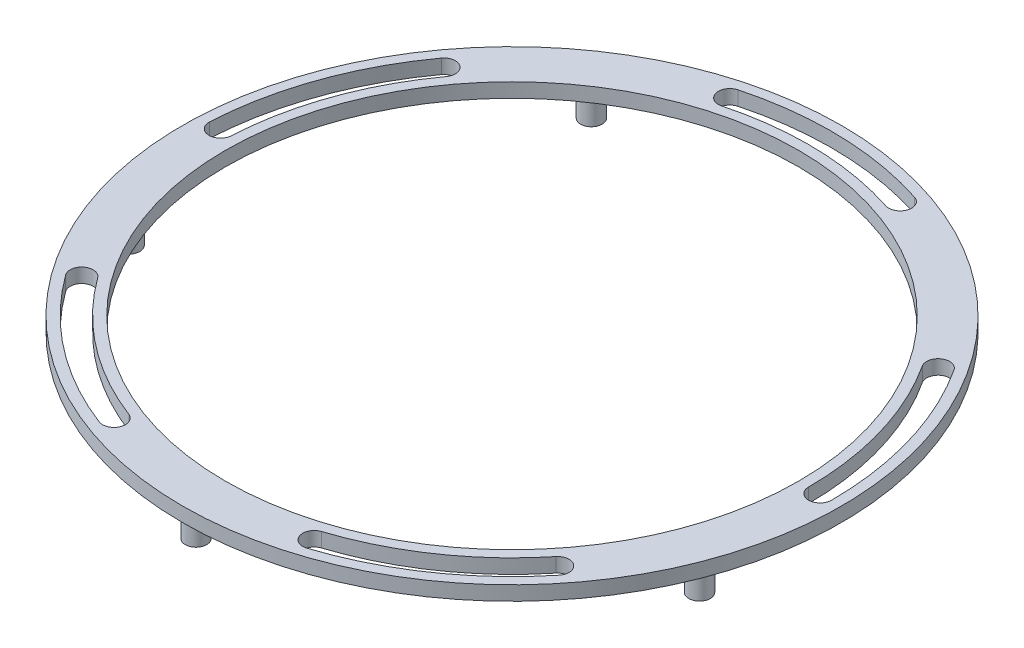
ISO-10303-21;
HEADER;
FILE_DESCRIPTION(('STEP AP214'),'2;1');
FILE_NAME('part.step','',(''),(''),'','','');
FILE_SCHEMA(('AUTOMOTIVE_DESIGN { 1 0 10303 214 1 1 1 1 }'));
ENDSEC;
DATA;
#1=APPLICATION_CONTEXT('core data for automotive mechanical design processes');
#2=APPLICATION_PROTOCOL_DEFINITION('international standard','automotive_design',2000,#1);
#3=PRODUCT_CONTEXT('',#1,'mechanical');
#4=PRODUCT('Part','Part','',(#3));
#5=PRODUCT_RELATED_PRODUCT_CATEGORY('part','',(#4));
#6=PRODUCT_DEFINITION_FORMATION('','',#4);
#7=PRODUCT_DEFINITION_CONTEXT('part definition',#1,'design');
#8=PRODUCT_DEFINITION('design','',#6,#7);
#9=PRODUCT_DEFINITION_SHAPE('','',#8);
#10=(LENGTH_UNIT() NAMED_UNIT(*) SI_UNIT(.MILLI.,.METRE.));
#11=(NAMED_UNIT(*) PLANE_ANGLE_UNIT() SI_UNIT($,.RADIAN.));
#12=(NAMED_UNIT(*) SI_UNIT($,.STERADIAN.) SOLID_ANGLE_UNIT());
#13=UNCERTAINTY_MEASURE_WITH_UNIT(LENGTH_MEASURE(1.E-05),#10,'distance_accuracy_value','');
#14=(GEOMETRIC_REPRESENTATION_CONTEXT(3) GLOBAL_UNCERTAINTY_ASSIGNED_CONTEXT((#13)) GLOBAL_UNIT_ASSIGNED_CONTEXT((#10,
#11,#12)) REPRESENTATION_CONTEXT('',''));
#15=CARTESIAN_POINT('',(0.,0.,0.));
#16=DIRECTION('',(0.,0.,1.));
#17=DIRECTION('',(1.,0.,0.));
#18=AXIS2_PLACEMENT_3D('',#15,#16,#17);
#19=CARTESIAN_POINT('',(0.,2.,0.));
#20=DIRECTION('',(0.,1.,0.));
#21=DIRECTION('',(0.,0.,1.));
#22=AXIS2_PLACEMENT_3D('',#19,#20,#21);
#23=PLANE('',#22);
#24=CARTESIAN_POINT('',(13.2877307581226,2.,-40.8954302006916));
#25=DIRECTION('',(0.,1.,0.));
#26=DIRECTION('',(0.951056516295155,0.,0.309016994374945));
#27=AXIS2_PLACEMENT_3D('',#24,#25,#26);
#28=CIRCLE('',#27,1.6);
#29=CARTESIAN_POINT('',(12.7933035671227,2.,-39.3737397746194));
#30=VERTEX_POINT('',#29);
#31=CARTESIAN_POINT('',(13.7821579491225,2.,-42.4171206267639));
#32=VERTEX_POINT('',#31);
#33=EDGE_CURVE('E50',#30,#32,#28,.T.);
#34=ORIENTED_EDGE('',*,*,#33,.F.);
#35=CARTESIAN_POINT('',(0.,2.,0.));
#36=DIRECTION('',(0.,-1.,0.));
#37=DIRECTION('',(0.951056516295155,0.,0.309016994374945));
#38=AXIS2_PLACEMENT_3D('',#35,#36,#37);
#39=CIRCLE('',#38,41.4);
#40=CARTESIAN_POINT('',(-10.7151084672446,2.,-39.9893292083674));
#41=VERTEX_POINT('',#40);
#42=EDGE_CURVE('E180',#41,#30,#39,.T.);
#43=ORIENTED_EDGE('',*,*,#42,.F.);
#44=CARTESIAN_POINT('',(-11.1292189394086,2.,-41.5348105304299));
#45=DIRECTION('',(0.,1.,0.));
#46=DIRECTION('',(0.951056516295155,0.,0.309016994374945));
#47=AXIS2_PLACEMENT_3D('',#44,#45,#46);
#48=CIRCLE('',#47,1.59999999999999);
#49=CARTESIAN_POINT('',(-11.5433294115726,2.,-43.0802918524924));
#50=VERTEX_POINT('',#49);
#51=EDGE_CURVE('E203',#50,#41,#48,.T.);
#52=ORIENTED_EDGE('',*,*,#51,.F.);
#53=CARTESIAN_POINT('',(0.,2.,0.));
#54=DIRECTION('',(0.,1.,0.));
#55=DIRECTION('',(0.951056516295155,0.,0.309016994374945));
#56=AXIS2_PLACEMENT_3D('',#53,#54,#55);
#57=CIRCLE('',#56,44.6);
#58=EDGE_CURVE('E196',#32,#50,#57,.T.);
#59=ORIENTED_EDGE('',*,*,#58,.F.);
#60=EDGE_LOOP('',(#34,#43,#52,#59));
#61=FACE_BOUND('',#60,.T.);
#62=CARTESIAN_POINT('',(-34.7877307581229,2.,-25.2747658485761));
#63=DIRECTION('',(0.,1.,0.));
#64=DIRECTION('',(0.587785252292469,0.,-0.809016994374951));
#65=AXIS2_PLACEMENT_3D('',#62,#63,#64);
#66=CIRCLE('',#65,1.6);
#67=CARTESIAN_POINT('',(-33.493303567123,2.,-24.3343094449082));
#68=VERTEX_POINT('',#67);
#69=CARTESIAN_POINT('',(-36.0821579491228,2.,-26.2152222522441));
#70=VERTEX_POINT('',#69);
#71=EDGE_CURVE('E58',#68,#70,#66,.T.);
#72=ORIENTED_EDGE('',*,*,#71,.F.);
#73=CARTESIAN_POINT('',(0.,2.,0.));
#74=DIRECTION('',(0.,-1.,0.));
#75=DIRECTION('',(0.587785252292469,0.,-0.809016994374951));
#76=AXIS2_PLACEMENT_3D('',#73,#74,#75);
#77=CIRCLE('',#76,41.4);
#78=CARTESIAN_POINT('',(-41.3432627388394,2.,-2.16670858845756));
#79=VERTEX_POINT('',#78);
#80=EDGE_CURVE('E232',#79,#68,#77,.T.);
#81=ORIENTED_EDGE('',*,*,#80,.F.);
#82=CARTESIAN_POINT('',(-42.9410699944467,2.,-2.25044611844627));
#83=DIRECTION('',(0.,1.,0.));
#84=DIRECTION('',(0.587785252292469,0.,-0.809016994374951));
#85=AXIS2_PLACEMENT_3D('',#82,#83,#84);
#86=CIRCLE('',#85,1.59999999999999);
#87=CARTESIAN_POINT('',(-44.538877250054,2.,-2.33418364843496));
#88=VERTEX_POINT('',#87);
#89=EDGE_CURVE('E229',#88,#79,#86,.T.);
#90=ORIENTED_EDGE('',*,*,#89,.F.);
#91=CARTESIAN_POINT('',(0.,2.,0.));
#92=DIRECTION('',(0.,1.,0.));
#93=DIRECTION('',(0.587785252292469,0.,-0.809016994374951));
#94=AXIS2_PLACEMENT_3D('',#91,#92,#93);
#95=CIRCLE('',#94,44.6);
#96=EDGE_CURVE('E226',#70,#88,#95,.T.);
#97=ORIENTED_EDGE('',*,*,#96,.F.);
#98=EDGE_LOOP('',(#72,#81,#90,#97));
#99=FACE_BOUND('',#98,.T.);
#100=CARTESIAN_POINT('',(-34.7877307581225,2.,25.2747658485766));
#101=DIRECTION('',(0.,1.,0.));
#102=DIRECTION('',(-0.58778525229248,0.,-0.809016994374942));
#103=AXIS2_PLACEMENT_3D('',#100,#101,#102);
#104=CIRCLE('',#103,1.6);
#105=CARTESIAN_POINT('',(-33.4933035671226,2.,24.3343094449087));
#106=VERTEX_POINT('',#105);
#107=CARTESIAN_POINT('',(-36.0821579491224,2.,26.2152222522446));
#108=VERTEX_POINT('',#107);
#109=EDGE_CURVE('E257',#106,#108,#104,.T.);
#110=ORIENTED_EDGE('',*,*,#109,.F.);
#111=CARTESIAN_POINT('',(0.,2.,0.));
#112=DIRECTION('',(0.,-1.,0.));
#113=DIRECTION('',(-0.58778525229248,0.,-0.809016994374942));
#114=AXIS2_PLACEMENT_3D('',#111,#112,#113);
#115=CIRCLE('',#114,41.4);
#116=CARTESIAN_POINT('',(-14.836433111175,2.,38.6502296569843));
#117=VERTEX_POINT('',#116);
#118=EDGE_CURVE('E265',#117,#106,#115,.T.);
#119=ORIENTED_EDGE('',*,*,#118,.F.);
#120=CARTESIAN_POINT('',(-15.4098218304475,2.,40.1439583393798));
#121=DIRECTION('',(0.,1.,0.));
#122=DIRECTION('',(-0.58778525229248,0.,-0.809016994374942));
#123=AXIS2_PLACEMENT_3D('',#120,#121,#122);
#124=CIRCLE('',#123,1.59999999999999);
#125=CARTESIAN_POINT('',(-15.9832105497199,2.,41.6376870217753));
#126=VERTEX_POINT('',#125);
#127=EDGE_CURVE('E262',#126,#117,#124,.T.);
#128=ORIENTED_EDGE('',*,*,#127,.F.);
#129=CARTESIAN_POINT('',(0.,2.,0.));
#130=DIRECTION('',(0.,1.,0.));
#131=DIRECTION('',(-0.58778525229248,0.,-0.809016994374942));
#132=AXIS2_PLACEMENT_3D('',#129,#130,#131);
#133=CIRCLE('',#132,44.6);
#134=EDGE_CURVE('E259',#108,#126,#133,.T.);
#135=ORIENTED_EDGE('',*,*,#134,.F.);
#136=EDGE_LOOP('',(#110,#119,#128,#135));
#137=FACE_BOUND('',#136,.T.);
#138=CARTESIAN_POINT('',(13.2877307581232,2.,40.8954302006915));
#139=DIRECTION('',(0.,1.,0.));
#140=DIRECTION('',(-0.95105651629515,0.,0.309016994374958));
#141=AXIS2_PLACEMENT_3D('',#138,#139,#140);
#142=CIRCLE('',#141,1.6);
#143=CARTESIAN_POINT('',(12.7933035671233,2.,39.3737397746192));
#144=VERTEX_POINT('',#143);
#145=CARTESIAN_POINT('',(13.7821579491231,2.,42.4171206267637));
#146=VERTEX_POINT('',#145);
#147=EDGE_CURVE('E291',#144,#146,#142,.T.);
#148=ORIENTED_EDGE('',*,*,#147,.F.);
#149=CARTESIAN_POINT('',(0.,2.,0.));
#150=DIRECTION('',(0.,-1.,0.));
#151=DIRECTION('',(-0.95105651629515,0.,0.309016994374958));
#152=AXIS2_PLACEMENT_3D('',#149,#150,#151);
#153=CIRCLE('',#152,41.4);
#154=CARTESIAN_POINT('',(32.1738428043189,2.,26.0538641894628));
#155=VERTEX_POINT('',#154);
#156=EDGE_CURVE('E299',#155,#144,#153,.T.);
#157=ORIENTED_EDGE('',*,*,#156,.F.);
#158=CARTESIAN_POINT('',(33.4172763426501,2.,27.0607768151426));
#159=DIRECTION('',(0.,1.,0.));
#160=DIRECTION('',(-0.95105651629515,0.,0.309016994374958));
#161=AXIS2_PLACEMENT_3D('',#158,#159,#160);
#162=CIRCLE('',#161,1.59999999999999);
#163=CARTESIAN_POINT('',(34.6607098809813,2.,28.0676894408223));
#164=VERTEX_POINT('',#163);
#165=EDGE_CURVE('E296',#164,#155,#162,.T.);
#166=ORIENTED_EDGE('',*,*,#165,.F.);
#167=CARTESIAN_POINT('',(0.,2.,0.));
#168=DIRECTION('',(0.,1.,0.));
#169=DIRECTION('',(-0.95105651629515,0.,0.309016994374958));
#170=AXIS2_PLACEMENT_3D('',#167,#168,#169);
#171=CIRCLE('',#170,44.6);
#172=EDGE_CURVE('E293',#146,#164,#171,.T.);
#173=ORIENTED_EDGE('',*,*,#172,.F.);
#174=EDGE_LOOP('',(#148,#157,#166,#173));
#175=FACE_BOUND('',#174,.T.);
#176=CARTESIAN_POINT('',(43.,2.,0.));
#177=DIRECTION('',(0.,1.,0.));
#178=DIRECTION('',(0.,0.,1.));
#179=AXIS2_PLACEMENT_3D('',#176,#177,#178);
#180=CIRCLE('',#179,1.6);
#181=CARTESIAN_POINT('',(41.4,2.,0.));
#182=VERTEX_POINT('',#181);
#183=CARTESIAN_POINT('',(44.6,2.,0.));
#184=VERTEX_POINT('',#183);
#185=EDGE_CURVE('E327',#182,#184,#180,.T.);
#186=ORIENTED_EDGE('',*,*,#185,.F.);
#187=CARTESIAN_POINT('',(0.,2.,0.));
#188=DIRECTION('',(0.,-1.,0.));
#189=DIRECTION('',(0.,0.,1.));
#190=AXIS2_PLACEMENT_3D('',#187,#188,#189);
#191=CIRCLE('',#190,41.4);
#192=CARTESIAN_POINT('',(34.7209615129405,2.,-22.5480560496222));
#193=VERTEX_POINT('',#192);
#194=EDGE_CURVE('E335',#193,#182,#191,.T.);
#195=ORIENTED_EDGE('',*,*,#194,.F.);
#196=CARTESIAN_POINT('',(36.0628344216532,2.,-23.4194785056462));
#197=DIRECTION('',(0.,1.,0.));
#198=DIRECTION('',(0.,0.,1.));
#199=AXIS2_PLACEMENT_3D('',#196,#197,#198);
#200=CIRCLE('',#199,1.59999999999999);
#201=CARTESIAN_POINT('',(37.4047073303659,2.,-24.2909009616703));
#202=VERTEX_POINT('',#201);
#203=EDGE_CURVE('E332',#202,#193,#200,.T.);
#204=ORIENTED_EDGE('',*,*,#203,.F.);
#205=CARTESIAN_POINT('',(0.,2.,0.));
#206=DIRECTION('',(0.,1.,0.));
#207=DIRECTION('',(0.,0.,1.));
#208=AXIS2_PLACEMENT_3D('',#205,#206,#207);
#209=CIRCLE('',#208,44.6);
#210=EDGE_CURVE('E329',#184,#202,#209,.T.);
#211=ORIENTED_EDGE('',*,*,#210,.F.);
#212=EDGE_LOOP('',(#186,#195,#204,#211));
#213=FACE_BOUND('',#212,.T.);
#214=CARTESIAN_POINT('',(0.,2.,0.));
#215=DIRECTION('',(0.,1.,0.));
#216=DIRECTION('',(0.,0.,1.));
#217=AXIS2_PLACEMENT_3D('',#214,#215,#216);
#218=CIRCLE('',#217,46.);
#219=CARTESIAN_POINT('',(0.,2.,46.));
#220=VERTEX_POINT('',#219);
#221=EDGE_CURVE('E11',#220,#220,#218,.T.);
#222=ORIENTED_EDGE('',*,*,#221,.T.);
#223=EDGE_LOOP('',(#222));
#224=FACE_BOUND('',#223,.T.);
#225=CARTESIAN_POINT('',(0.,2.,0.));
#226=DIRECTION('',(0.,1.,0.));
#227=DIRECTION('',(0.,0.,1.));
#228=AXIS2_PLACEMENT_3D('',#225,#226,#227);
#229=CIRCLE('',#228,40.);
#230=CARTESIAN_POINT('',(0.,2.,40.));
#231=VERTEX_POINT('',#230);
#232=EDGE_CURVE('E353',#231,#231,#229,.T.);
#233=ORIENTED_EDGE('',*,*,#232,.F.);
#234=EDGE_LOOP('',(#233));
#235=FACE_BOUND('',#234,.T.);
#236=ADVANCED_FACE('F35',(#61,#99,#137,#175,#213,#224,#235),#23,.T.);
#237=CARTESIAN_POINT('',(0.,0.,0.));
#238=DIRECTION('',(0.,1.,0.));
#239=DIRECTION('',(0.,0.,1.));
#240=AXIS2_PLACEMENT_3D('',#237,#238,#239);
#241=PLANE('',#240);
#242=CARTESIAN_POINT('',(0.,0.,0.));
#243=DIRECTION('',(0.,1.,0.));
#244=DIRECTION('',(0.,0.,1.));
#245=AXIS2_PLACEMENT_3D('',#242,#243,#244);
#246=CIRCLE('',#245,41.4);
#247=CARTESIAN_POINT('',(12.7933035671227,0.,-39.3737397746194));
#248=VERTEX_POINT('',#247);
#249=CARTESIAN_POINT('',(-10.7151084672446,0.,-39.9893292083674));
#250=VERTEX_POINT('',#249);
#251=EDGE_CURVE('E194',#248,#250,#246,.T.);
#252=ORIENTED_EDGE('',*,*,#251,.F.);
#253=CARTESIAN_POINT('',(13.2877307581226,0.,-40.8954302006916));
#254=DIRECTION('',(0.,1.,0.));
#255=DIRECTION('',(0.,0.,1.));
#256=AXIS2_PLACEMENT_3D('',#253,#254,#255);
#257=CIRCLE('',#256,1.6);
#258=CARTESIAN_POINT('',(13.7821579491225,0.,-42.4171206267639));
#259=VERTEX_POINT('',#258);
#260=EDGE_CURVE('E174',#259,#248,#257,.F.);
#261=ORIENTED_EDGE('',*,*,#260,.F.);
#262=CARTESIAN_POINT('',(0.,0.,0.));
#263=DIRECTION('',(0.,1.,0.));
#264=DIRECTION('',(0.,0.,1.));
#265=AXIS2_PLACEMENT_3D('',#262,#263,#264);
#266=CIRCLE('',#265,44.6);
#267=CARTESIAN_POINT('',(-11.5433294115726,0.,-43.0802918524924));
#268=VERTEX_POINT('',#267);
#269=EDGE_CURVE('E184',#268,#259,#266,.F.);
#270=ORIENTED_EDGE('',*,*,#269,.F.);
#271=CARTESIAN_POINT('',(-11.1292189394086,0.,-41.5348105304299));
#272=DIRECTION('',(0.,1.,0.));
#273=DIRECTION('',(0.,0.,1.));
#274=AXIS2_PLACEMENT_3D('',#271,#272,#273);
#275=CIRCLE('',#274,1.59999999999999);
#276=EDGE_CURVE('E198',#250,#268,#275,.F.);
#277=ORIENTED_EDGE('',*,*,#276,.F.);
#278=EDGE_LOOP('',(#252,#261,#270,#277));
#279=FACE_BOUND('',#278,.T.);
#280=CARTESIAN_POINT('',(-24.355468187768,0.,-35.4374261107465));
#281=DIRECTION('',(0.,1.,0.));
#282=DIRECTION('',(0.,0.,1.));
#283=AXIS2_PLACEMENT_3D('',#280,#281,#282);
#284=CIRCLE('',#283,1.5);
#285=CARTESIAN_POINT('',(-24.355468187768,0.,-33.9374261107465));
#286=VERTEX_POINT('',#285);
#287=EDGE_CURVE('E212',#286,#286,#284,.F.);
#288=ORIENTED_EDGE('',*,*,#287,.F.);
#289=EDGE_LOOP('',(#288));
#290=FACE_BOUND('',#289,.T.);
#291=CARTESIAN_POINT('',(0.,0.,0.));
#292=DIRECTION('',(0.,1.,0.));
#293=DIRECTION('',(0.,0.,1.));
#294=AXIS2_PLACEMENT_3D('',#291,#292,#293);
#295=CIRCLE('',#294,41.4);
#296=CARTESIAN_POINT('',(-33.493303567123,0.,-24.3343094449082));
#297=VERTEX_POINT('',#296);
#298=CARTESIAN_POINT('',(-41.3432627388394,0.,-2.16670858845756));
#299=VERTEX_POINT('',#298);
#300=EDGE_CURVE('E218',#297,#299,#295,.T.);
#301=ORIENTED_EDGE('',*,*,#300,.F.);
#302=CARTESIAN_POINT('',(-34.7877307581229,0.,-25.2747658485761));
#303=DIRECTION('',(0.,1.,0.));
#304=DIRECTION('',(0.,0.,1.));
#305=AXIS2_PLACEMENT_3D('',#302,#303,#304);
#306=CIRCLE('',#305,1.6);
#307=CARTESIAN_POINT('',(-36.0821579491228,0.,-26.2152222522441));
#308=VERTEX_POINT('',#307);
#309=EDGE_CURVE('E222',#308,#297,#306,.F.);
#310=ORIENTED_EDGE('',*,*,#309,.F.);
#311=CARTESIAN_POINT('',(0.,0.,0.));
#312=DIRECTION('',(0.,1.,0.));
#313=DIRECTION('',(0.,0.,1.));
#314=AXIS2_PLACEMENT_3D('',#311,#312,#313);
#315=CIRCLE('',#314,44.6);
#316=CARTESIAN_POINT('',(-44.538877250054,0.,-2.33418364843496));
#317=VERTEX_POINT('',#316);
#318=EDGE_CURVE('E215',#317,#308,#315,.F.);
#319=ORIENTED_EDGE('',*,*,#318,.F.);
#320=CARTESIAN_POINT('',(-42.9410699944467,0.,-2.25044611844627));
#321=DIRECTION('',(0.,1.,0.));
#322=DIRECTION('',(0.,0.,1.));
#323=AXIS2_PLACEMENT_3D('',#320,#321,#322);
#324=CIRCLE('',#323,1.59999999999999);
#325=EDGE_CURVE('E216',#299,#317,#324,.F.);
#326=ORIENTED_EDGE('',*,*,#325,.F.);
#327=EDGE_LOOP('',(#301,#310,#319,#326));
#328=FACE_BOUND('',#327,.T.);
#329=CARTESIAN_POINT('',(-41.2292485993322,0.,12.212659822269));
#330=DIRECTION('',(0.,1.,0.));
#331=DIRECTION('',(0.,0.,1.));
#332=AXIS2_PLACEMENT_3D('',#329,#330,#331);
#333=CIRCLE('',#332,1.5);
#334=CARTESIAN_POINT('',(-41.2292485993322,0.,13.712659822269));
#335=VERTEX_POINT('',#334);
#336=EDGE_CURVE('E219',#335,#335,#333,.F.);
#337=ORIENTED_EDGE('',*,*,#336,.F.);
#338=EDGE_LOOP('',(#337));
#339=FACE_BOUND('',#338,.T.);
#340=CARTESIAN_POINT('',(0.,0.,0.));
#341=DIRECTION('',(0.,1.,0.));
#342=DIRECTION('',(0.,0.,1.));
#343=AXIS2_PLACEMENT_3D('',#340,#341,#342);
#344=CIRCLE('',#343,41.4);
#345=CARTESIAN_POINT('',(-33.4933035671226,0.,24.3343094449087));
#346=VERTEX_POINT('',#345);
#347=CARTESIAN_POINT('',(-14.836433111175,0.,38.6502296569843));
#348=VERTEX_POINT('',#347);
#349=EDGE_CURVE('E250',#346,#348,#344,.T.);
#350=ORIENTED_EDGE('',*,*,#349,.F.);
#351=CARTESIAN_POINT('',(-34.7877307581225,0.,25.2747658485766));
#352=DIRECTION('',(0.,1.,0.));
#353=DIRECTION('',(0.,0.,1.));
#354=AXIS2_PLACEMENT_3D('',#351,#352,#353);
#355=CIRCLE('',#354,1.6);
#356=CARTESIAN_POINT('',(-36.0821579491224,0.,26.2152222522446));
#357=VERTEX_POINT('',#356);
#358=EDGE_CURVE('E254',#357,#346,#355,.F.);
#359=ORIENTED_EDGE('',*,*,#358,.F.);
#360=CARTESIAN_POINT('',(0.,0.,0.));
#361=DIRECTION('',(0.,1.,0.));
#362=DIRECTION('',(0.,0.,1.));
#363=AXIS2_PLACEMENT_3D('',#360,#361,#362);
#364=CIRCLE('',#363,44.6);
#365=CARTESIAN_POINT('',(-15.9832105497199,0.,41.6376870217753));
#366=VERTEX_POINT('',#365);
#367=EDGE_CURVE('E247',#366,#357,#364,.F.);
#368=ORIENTED_EDGE('',*,*,#367,.F.);
#369=CARTESIAN_POINT('',(-15.4098218304475,0.,40.1439583393798));
#370=DIRECTION('',(0.,1.,0.));
#371=DIRECTION('',(0.,0.,1.));
#372=AXIS2_PLACEMENT_3D('',#369,#370,#371);
#373=CIRCLE('',#372,1.59999999999999);
#374=EDGE_CURVE('E248',#348,#366,#373,.F.);
#375=ORIENTED_EDGE('',*,*,#374,.F.);
#376=EDGE_LOOP('',(#350,#359,#368,#375));
#377=FACE_BOUND('',#376,.T.);
#378=CARTESIAN_POINT('',(-1.12560877723803,0.,42.985264973949));
#379=DIRECTION('',(0.,1.,0.));
#380=DIRECTION('',(0.,0.,1.));
#381=AXIS2_PLACEMENT_3D('',#378,#379,#380);
#382=CIRCLE('',#381,1.5);
#383=CARTESIAN_POINT('',(-1.12560877723803,0.,44.485264973949));
#384=VERTEX_POINT('',#383);
#385=EDGE_CURVE('E251',#384,#384,#382,.F.);
#386=ORIENTED_EDGE('',*,*,#385,.F.);
#387=EDGE_LOOP('',(#386));
#388=FACE_BOUND('',#387,.T.);
#389=CARTESIAN_POINT('',(0.,0.,0.));
#390=DIRECTION('',(0.,1.,0.));
#391=DIRECTION('',(0.,0.,1.));
#392=AXIS2_PLACEMENT_3D('',#389,#390,#391);
#393=CIRCLE('',#392,41.4);
#394=CARTESIAN_POINT('',(12.7933035671233,0.,39.3737397746192));
#395=VERTEX_POINT('',#394);
#396=CARTESIAN_POINT('',(32.1738428043189,0.,26.0538641894628));
#397=VERTEX_POINT('',#396);
#398=EDGE_CURVE('E284',#395,#397,#393,.T.);
#399=ORIENTED_EDGE('',*,*,#398,.F.);
#400=CARTESIAN_POINT('',(13.2877307581232,0.,40.8954302006915));
#401=DIRECTION('',(0.,1.,0.));
#402=DIRECTION('',(0.,0.,1.));
#403=AXIS2_PLACEMENT_3D('',#400,#401,#402);
#404=CIRCLE('',#403,1.6);
#405=CARTESIAN_POINT('',(13.7821579491231,0.,42.4171206267637));
#406=VERTEX_POINT('',#405);
#407=EDGE_CURVE('E288',#406,#395,#404,.F.);
#408=ORIENTED_EDGE('',*,*,#407,.F.);
#409=CARTESIAN_POINT('',(0.,0.,0.));
#410=DIRECTION('',(0.,1.,0.));
#411=DIRECTION('',(0.,0.,1.));
#412=AXIS2_PLACEMENT_3D('',#409,#410,#411);
#413=CIRCLE('',#412,44.6);
#414=CARTESIAN_POINT('',(34.6607098809813,0.,28.0676894408223));
#415=VERTEX_POINT('',#414);
#416=EDGE_CURVE('E281',#415,#406,#413,.F.);
#417=ORIENTED_EDGE('',*,*,#416,.F.);
#418=CARTESIAN_POINT('',(33.4172763426501,0.,27.0607768151426));
#419=DIRECTION('',(0.,1.,0.));
#420=DIRECTION('',(0.,0.,1.));
#421=AXIS2_PLACEMENT_3D('',#418,#419,#420);
#422=CIRCLE('',#421,1.59999999999999);
#423=EDGE_CURVE('E282',#397,#415,#422,.F.);
#424=ORIENTED_EDGE('',*,*,#423,.F.);
#425=EDGE_LOOP('',(#399,#408,#417,#424));
#426=FACE_BOUND('',#425,.T.);
#427=CARTESIAN_POINT('',(40.5335841169639,0.,14.3536949470516));
#428=DIRECTION('',(0.,1.,0.));
#429=DIRECTION('',(0.,0.,1.));
#430=AXIS2_PLACEMENT_3D('',#427,#428,#429);
#431=CIRCLE('',#430,1.5);
#432=CARTESIAN_POINT('',(40.5335841169639,0.,15.8536949470516));
#433=VERTEX_POINT('',#432);
#434=EDGE_CURVE('E285',#433,#433,#431,.F.);
#435=ORIENTED_EDGE('',*,*,#434,.F.);
#436=EDGE_LOOP('',(#435));
#437=FACE_BOUND('',#436,.T.);
#438=CARTESIAN_POINT('',(0.,0.,0.));
#439=DIRECTION('',(0.,1.,0.));
#440=DIRECTION('',(0.,0.,1.));
#441=AXIS2_PLACEMENT_3D('',#438,#439,#440);
#442=CIRCLE('',#441,41.4);
#443=CARTESIAN_POINT('',(41.4,0.,0.));
#444=VERTEX_POINT('',#443);
#445=CARTESIAN_POINT('',(34.7209615129405,0.,-22.5480560496222));
#446=VERTEX_POINT('',#445);
#447=EDGE_CURVE('E321',#444,#446,#442,.T.);
#448=ORIENTED_EDGE('',*,*,#447,.F.);
#449=CARTESIAN_POINT('',(43.,0.,0.));
#450=DIRECTION('',(0.,1.,0.));
#451=DIRECTION('',(0.,0.,1.));
#452=AXIS2_PLACEMENT_3D('',#449,#450,#451);
#453=CIRCLE('',#452,1.6);
#454=CARTESIAN_POINT('',(44.6,0.,0.));
#455=VERTEX_POINT('',#454);
#456=EDGE_CURVE('E324',#455,#444,#453,.F.);
#457=ORIENTED_EDGE('',*,*,#456,.F.);
#458=CARTESIAN_POINT('',(0.,0.,0.));
#459=DIRECTION('',(0.,1.,0.));
#460=DIRECTION('',(0.,0.,1.));
#461=AXIS2_PLACEMENT_3D('',#458,#459,#460);
#462=CIRCLE('',#461,44.6);
#463=CARTESIAN_POINT('',(37.4047073303659,0.,-24.2909009616703));
#464=VERTEX_POINT('',#463);
#465=EDGE_CURVE('E341',#464,#455,#462,.F.);
#466=ORIENTED_EDGE('',*,*,#465,.F.);
#467=CARTESIAN_POINT('',(36.0628344216532,0.,-23.4194785056462));
#468=DIRECTION('',(0.,1.,0.));
#469=DIRECTION('',(0.,0.,1.));
#470=AXIS2_PLACEMENT_3D('',#467,#468,#469);
#471=CIRCLE('',#470,1.59999999999999);
#472=EDGE_CURVE('E319',#446,#464,#471,.F.);
#473=ORIENTED_EDGE('',*,*,#472,.F.);
#474=EDGE_LOOP('',(#448,#457,#466,#473));
#475=FACE_BOUND('',#474,.T.);
#476=CARTESIAN_POINT('',(26.1767414473749,0.,-34.1141936325232));
#477=DIRECTION('',(0.,1.,0.));
#478=DIRECTION('',(0.,0.,1.));
#479=AXIS2_PLACEMENT_3D('',#476,#477,#478);
#480=CIRCLE('',#479,1.5);
#481=CARTESIAN_POINT('',(26.1767414473749,0.,-32.6141936325232));
#482=VERTEX_POINT('',#481);
#483=EDGE_CURVE('E318',#482,#482,#480,.F.);
#484=ORIENTED_EDGE('',*,*,#483,.F.);
#485=EDGE_LOOP('',(#484));
#486=FACE_BOUND('',#485,.T.);
#487=CARTESIAN_POINT('',(0.,0.,0.));
#488=DIRECTION('',(0.,1.,0.));
#489=DIRECTION('',(0.,0.,1.));
#490=AXIS2_PLACEMENT_3D('',#487,#488,#489);
#491=CIRCLE('',#490,46.);
#492=CARTESIAN_POINT('',(0.,0.,46.));
#493=VERTEX_POINT('',#492);
#494=EDGE_CURVE('E39',#493,#493,#491,.T.);
#495=ORIENTED_EDGE('',*,*,#494,.F.);
#496=EDGE_LOOP('',(#495));
#497=FACE_BOUND('',#496,.T.);
#498=CARTESIAN_POINT('',(0.,0.,0.));
#499=DIRECTION('',(0.,1.,0.));
#500=DIRECTION('',(0.,0.,1.));
#501=AXIS2_PLACEMENT_3D('',#498,#499,#500);
#502=CIRCLE('',#501,40.);
#503=CARTESIAN_POINT('',(0.,0.,40.));
#504=VERTEX_POINT('',#503);
#505=EDGE_CURVE('E350',#504,#504,#502,.T.);
#506=ORIENTED_EDGE('',*,*,#505,.T.);
#507=EDGE_LOOP('',(#506));
#508=FACE_BOUND('',#507,.T.);
#509=ADVANCED_FACE('F191',(#279,#290,#328,#339,#377,#388,#426,#437,#475,#486,#497,#508),#241,.F.);
#510=CARTESIAN_POINT('',(0.,2.,0.));
#511=DIRECTION('',(0.,-1.,0.));
#512=DIRECTION('',(0.,0.,-1.));
#513=AXIS2_PLACEMENT_3D('',#510,#511,#512);
#514=CYLINDRICAL_SURFACE('',#513,46.);
#515=ORIENTED_EDGE('',*,*,#221,.F.);
#516=EDGE_LOOP('',(#515));
#517=FACE_BOUND('',#516,.T.);
#518=ORIENTED_EDGE('',*,*,#494,.T.);
#519=EDGE_LOOP('',(#518));
#520=FACE_BOUND('',#519,.T.);
#521=ADVANCED_FACE('F37',(#517,#520),#514,.T.);
#522=CARTESIAN_POINT('',(0.,2.,0.));
#523=DIRECTION('',(0.,-1.,0.));
#524=DIRECTION('',(0.,0.,-1.));
#525=AXIS2_PLACEMENT_3D('',#522,#523,#524);
#526=CYLINDRICAL_SURFACE('',#525,40.);
#527=ORIENTED_EDGE('',*,*,#232,.T.);
#528=EDGE_LOOP('',(#527));
#529=FACE_BOUND('',#528,.T.);
#530=ORIENTED_EDGE('',*,*,#505,.F.);
#531=EDGE_LOOP('',(#530));
#532=FACE_BOUND('',#531,.T.);
#533=ADVANCED_FACE('F360',(#529,#532),#526,.F.);
#534=CARTESIAN_POINT('',(43.,-0.00100000000000013,0.));
#535=DIRECTION('',(0.,1.,0.));
#536=DIRECTION('',(0.,0.,1.));
#537=AXIS2_PLACEMENT_3D('',#534,#535,#536);
#538=CYLINDRICAL_SURFACE('',#537,1.6);
#539=ORIENTED_EDGE('',*,*,#456,.T.);
#540=DIRECTION('',(0.,1.,0.));
#541=VECTOR('',#540,1.);
#542=CARTESIAN_POINT('',(41.4,-0.00100000000000013,0.));
#543=LINE('',#542,#541);
#544=EDGE_CURVE('E339',#444,#182,#543,.T.);
#545=ORIENTED_EDGE('',*,*,#544,.T.);
#546=ORIENTED_EDGE('',*,*,#185,.T.);
#547=DIRECTION('',(0.,1.,0.));
#548=VECTOR('',#547,1.);
#549=CARTESIAN_POINT('',(44.6,-0.00100000000000013,0.));
#550=LINE('',#549,#548);
#551=EDGE_CURVE('E338',#455,#184,#550,.T.);
#552=ORIENTED_EDGE('',*,*,#551,.F.);
#553=EDGE_LOOP('',(#539,#545,#546,#552));
#554=FACE_BOUND('',#553,.T.);
#555=ADVANCED_FACE('F362',(#554),#538,.F.);
#556=CARTESIAN_POINT('',(0.,-0.00100000000000013,0.));
#557=DIRECTION('',(0.,1.,0.));
#558=DIRECTION('',(0.,0.,1.));
#559=AXIS2_PLACEMENT_3D('',#556,#557,#558);
#560=CYLINDRICAL_SURFACE('',#559,41.4);
#561=ORIENTED_EDGE('',*,*,#447,.T.);
#562=DIRECTION('',(0.,1.,0.));
#563=VECTOR('',#562,1.);
#564=CARTESIAN_POINT('',(34.7209615129405,-0.00100000000000013,-22.5480560496222));
#565=LINE('',#564,#563);
#566=EDGE_CURVE('E342',#446,#193,#565,.T.);
#567=ORIENTED_EDGE('',*,*,#566,.T.);
#568=ORIENTED_EDGE('',*,*,#194,.T.);
#569=ORIENTED_EDGE('',*,*,#544,.F.);
#570=EDGE_LOOP('',(#561,#567,#568,#569));
#571=FACE_BOUND('',#570,.T.);
#572=ADVANCED_FACE('F369',(#571),#560,.T.);
#573=CARTESIAN_POINT('',(36.0628344216532,-0.00100000000000013,-23.4194785056462));
#574=DIRECTION('',(0.,1.,0.));
#575=DIRECTION('',(0.,0.,1.));
#576=AXIS2_PLACEMENT_3D('',#573,#574,#575);
#577=CYLINDRICAL_SURFACE('',#576,1.59999999999999);
#578=ORIENTED_EDGE('',*,*,#472,.T.);
#579=DIRECTION('',(0.,1.,0.));
#580=VECTOR('',#579,1.);
#581=CARTESIAN_POINT('',(37.4047073303659,-0.00100000000000013,-24.2909009616703));
#582=LINE('',#581,#580);
#583=EDGE_CURVE('E344',#464,#202,#582,.T.);
#584=ORIENTED_EDGE('',*,*,#583,.T.);
#585=ORIENTED_EDGE('',*,*,#203,.T.);
#586=ORIENTED_EDGE('',*,*,#566,.F.);
#587=EDGE_LOOP('',(#578,#584,#585,#586));
#588=FACE_BOUND('',#587,.T.);
#589=ADVANCED_FACE('F415',(#588),#577,.F.);
#590=CARTESIAN_POINT('',(0.,-0.00100000000000013,0.));
#591=DIRECTION('',(0.,1.,0.));
#592=DIRECTION('',(0.,0.,1.));
#593=AXIS2_PLACEMENT_3D('',#590,#591,#592);
#594=CYLINDRICAL_SURFACE('',#593,44.6);
#595=ORIENTED_EDGE('',*,*,#465,.T.);
#596=ORIENTED_EDGE('',*,*,#551,.T.);
#597=ORIENTED_EDGE('',*,*,#210,.T.);
#598=ORIENTED_EDGE('',*,*,#583,.F.);
#599=EDGE_LOOP('',(#595,#596,#597,#598));
#600=FACE_BOUND('',#599,.T.);
#601=ADVANCED_FACE('F405',(#600),#594,.F.);
#602=CARTESIAN_POINT('',(26.1767414473749,-4.,-34.1141936325232));
#603=DIRECTION('',(0.,1.,0.));
#604=DIRECTION('',(0.,0.,1.));
#605=AXIS2_PLACEMENT_3D('',#602,#603,#604);
#606=CYLINDRICAL_SURFACE('',#605,1.5);
#607=CARTESIAN_POINT('',(26.1767414473749,-4.,-34.1141936325232));
#608=DIRECTION('',(0.,1.,0.));
#609=DIRECTION('',(0.,0.,1.));
#610=AXIS2_PLACEMENT_3D('',#607,#608,#609);
#611=CIRCLE('',#610,1.5);
#612=CARTESIAN_POINT('',(26.1767414473749,-4.,-32.6141936325232));
#613=VERTEX_POINT('',#612);
#614=EDGE_CURVE('E188',#613,#613,#611,.T.);
#615=ORIENTED_EDGE('',*,*,#614,.T.);
#616=EDGE_LOOP('',(#615));
#617=FACE_BOUND('',#616,.T.);
#618=ORIENTED_EDGE('',*,*,#483,.T.);
#619=EDGE_LOOP('',(#618));
#620=FACE_BOUND('',#619,.T.);
#621=ADVANCED_FACE('F422',(#617,#620),#606,.T.);
#622=CARTESIAN_POINT('',(26.1767414473749,-4.,-34.1141936325232));
#623=DIRECTION('',(0.,1.,0.));
#624=DIRECTION('',(0.,0.,1.));
#625=AXIS2_PLACEMENT_3D('',#622,#623,#624);
#626=PLANE('',#625);
#627=ORIENTED_EDGE('',*,*,#614,.F.);
#628=EDGE_LOOP('',(#627));
#629=FACE_BOUND('',#628,.T.);
#630=ADVANCED_FACE('F428',(#629),#626,.F.);
#631=CARTESIAN_POINT('',(13.2877307581232,-4.001,40.8954302006915));
#632=DIRECTION('',(0.,1.,0.));
#633=DIRECTION('',(0.,0.,1.));
#634=AXIS2_PLACEMENT_3D('',#631,#632,#633);
#635=CYLINDRICAL_SURFACE('',#634,1.6);
#636=ORIENTED_EDGE('',*,*,#407,.T.);
#637=DIRECTION('',(0.,1.,0.));
#638=VECTOR('',#637,1.);
#639=CARTESIAN_POINT('',(12.7933035671233,-4.001,39.3737397746192));
#640=LINE('',#639,#638);
#641=EDGE_CURVE('E303',#395,#144,#640,.T.);
#642=ORIENTED_EDGE('',*,*,#641,.T.);
#643=ORIENTED_EDGE('',*,*,#147,.T.);
#644=DIRECTION('',(0.,1.,0.));
#645=VECTOR('',#644,1.);
#646=CARTESIAN_POINT('',(13.7821579491231,-4.001,42.4171206267637));
#647=LINE('',#646,#645);
#648=EDGE_CURVE('E302',#406,#146,#647,.T.);
#649=ORIENTED_EDGE('',*,*,#648,.F.);
#650=EDGE_LOOP('',(#636,#642,#643,#649));
#651=FACE_BOUND('',#650,.T.);
#652=ADVANCED_FACE('F432',(#651),#635,.F.);
#653=CARTESIAN_POINT('',(0.,-4.001,0.));
#654=DIRECTION('',(0.,1.,0.));
#655=DIRECTION('',(0.,0.,1.));
#656=AXIS2_PLACEMENT_3D('',#653,#654,#655);
#657=CYLINDRICAL_SURFACE('',#656,41.4);
#658=ORIENTED_EDGE('',*,*,#398,.T.);
#659=DIRECTION('',(0.,1.,0.));
#660=VECTOR('',#659,1.);
#661=CARTESIAN_POINT('',(32.1738428043189,-4.001,26.0538641894628));
#662=LINE('',#661,#660);
#663=EDGE_CURVE('E305',#397,#155,#662,.T.);
#664=ORIENTED_EDGE('',*,*,#663,.T.);
#665=ORIENTED_EDGE('',*,*,#156,.T.);
#666=ORIENTED_EDGE('',*,*,#641,.F.);
#667=EDGE_LOOP('',(#658,#664,#665,#666));
#668=FACE_BOUND('',#667,.T.);
#669=ADVANCED_FACE('F436',(#668),#657,.T.);
#670=CARTESIAN_POINT('',(33.4172763426501,-4.001,27.0607768151426));
#671=DIRECTION('',(0.,1.,0.));
#672=DIRECTION('',(0.,0.,1.));
#673=AXIS2_PLACEMENT_3D('',#670,#671,#672);
#674=CYLINDRICAL_SURFACE('',#673,1.59999999999999);
#675=ORIENTED_EDGE('',*,*,#423,.T.);
#676=DIRECTION('',(0.,1.,0.));
#677=VECTOR('',#676,1.);
#678=CARTESIAN_POINT('',(34.6607098809813,-4.001,28.0676894408223));
#679=LINE('',#678,#677);
#680=EDGE_CURVE('E307',#415,#164,#679,.T.);
#681=ORIENTED_EDGE('',*,*,#680,.T.);
#682=ORIENTED_EDGE('',*,*,#165,.T.);
#683=ORIENTED_EDGE('',*,*,#663,.F.);
#684=EDGE_LOOP('',(#675,#681,#682,#683));
#685=FACE_BOUND('',#684,.T.);
#686=ADVANCED_FACE('F442',(#685),#674,.F.);
#687=CARTESIAN_POINT('',(0.,-4.001,0.));
#688=DIRECTION('',(0.,1.,0.));
#689=DIRECTION('',(0.,0.,1.));
#690=AXIS2_PLACEMENT_3D('',#687,#688,#689);
#691=CYLINDRICAL_SURFACE('',#690,44.6);
#692=ORIENTED_EDGE('',*,*,#416,.T.);
#693=ORIENTED_EDGE('',*,*,#648,.T.);
#694=ORIENTED_EDGE('',*,*,#172,.T.);
#695=ORIENTED_EDGE('',*,*,#680,.F.);
#696=EDGE_LOOP('',(#692,#693,#694,#695));
#697=FACE_BOUND('',#696,.T.);
#698=ADVANCED_FACE('F438',(#697),#691,.F.);
#699=CARTESIAN_POINT('',(-34.7877307581225,-4.001,25.2747658485766));
#700=DIRECTION('',(0.,1.,0.));
#701=DIRECTION('',(0.,0.,1.));
#702=AXIS2_PLACEMENT_3D('',#699,#700,#701);
#703=CYLINDRICAL_SURFACE('',#702,1.6);
#704=ORIENTED_EDGE('',*,*,#358,.T.);
#705=DIRECTION('',(0.,1.,0.));
#706=VECTOR('',#705,1.);
#707=CARTESIAN_POINT('',(-33.4933035671226,-4.001,24.3343094449087));
#708=LINE('',#707,#706);
#709=EDGE_CURVE('E269',#346,#106,#708,.T.);
#710=ORIENTED_EDGE('',*,*,#709,.T.);
#711=ORIENTED_EDGE('',*,*,#109,.T.);
#712=DIRECTION('',(0.,1.,0.));
#713=VECTOR('',#712,1.);
#714=CARTESIAN_POINT('',(-36.0821579491224,-4.001,26.2152222522446));
#715=LINE('',#714,#713);
#716=EDGE_CURVE('E268',#357,#108,#715,.T.);
#717=ORIENTED_EDGE('',*,*,#716,.F.);
#718=EDGE_LOOP('',(#704,#710,#711,#717));
#719=FACE_BOUND('',#718,.T.);
#720=ADVANCED_FACE('F441',(#719),#703,.F.);
#721=CARTESIAN_POINT('',(0.,-4.001,0.));
#722=DIRECTION('',(0.,1.,0.));
#723=DIRECTION('',(0.,0.,1.));
#724=AXIS2_PLACEMENT_3D('',#721,#722,#723);
#725=CYLINDRICAL_SURFACE('',#724,41.4);
#726=ORIENTED_EDGE('',*,*,#349,.T.);
#727=DIRECTION('',(0.,1.,0.));
#728=VECTOR('',#727,1.);
#729=CARTESIAN_POINT('',(-14.836433111175,-4.001,38.6502296569843));
#730=LINE('',#729,#728);
#731=EDGE_CURVE('E271',#348,#117,#730,.T.);
#732=ORIENTED_EDGE('',*,*,#731,.T.);
#733=ORIENTED_EDGE('',*,*,#118,.T.);
#734=ORIENTED_EDGE('',*,*,#709,.F.);
#735=EDGE_LOOP('',(#726,#732,#733,#734));
#736=FACE_BOUND('',#735,.T.);
#737=ADVANCED_FACE('F452',(#736),#725,.T.);
#738=CARTESIAN_POINT('',(-15.4098218304475,-4.001,40.1439583393798));
#739=DIRECTION('',(0.,1.,0.));
#740=DIRECTION('',(0.,0.,1.));
#741=AXIS2_PLACEMENT_3D('',#738,#739,#740);
#742=CYLINDRICAL_SURFACE('',#741,1.59999999999999);
#743=ORIENTED_EDGE('',*,*,#374,.T.);
#744=DIRECTION('',(0.,1.,0.));
#745=VECTOR('',#744,1.);
#746=CARTESIAN_POINT('',(-15.9832105497199,-4.001,41.6376870217753));
#747=LINE('',#746,#745);
#748=EDGE_CURVE('E273',#366,#126,#747,.T.);
#749=ORIENTED_EDGE('',*,*,#748,.T.);
#750=ORIENTED_EDGE('',*,*,#127,.T.);
#751=ORIENTED_EDGE('',*,*,#731,.F.);
#752=EDGE_LOOP('',(#743,#749,#750,#751));
#753=FACE_BOUND('',#752,.T.);
#754=ADVANCED_FACE('F458',(#753),#742,.F.);
#755=CARTESIAN_POINT('',(0.,-4.001,0.));
#756=DIRECTION('',(0.,1.,0.));
#757=DIRECTION('',(0.,0.,1.));
#758=AXIS2_PLACEMENT_3D('',#755,#756,#757);
#759=CYLINDRICAL_SURFACE('',#758,44.6);
#760=ORIENTED_EDGE('',*,*,#367,.T.);
#761=ORIENTED_EDGE('',*,*,#716,.T.);
#762=ORIENTED_EDGE('',*,*,#134,.T.);
#763=ORIENTED_EDGE('',*,*,#748,.F.);
#764=EDGE_LOOP('',(#760,#761,#762,#763));
#765=FACE_BOUND('',#764,.T.);
#766=ADVANCED_FACE('F454',(#765),#759,.F.);
#767=CARTESIAN_POINT('',(-34.7877307581229,-4.001,-25.2747658485761));
#768=DIRECTION('',(0.,1.,0.));
#769=DIRECTION('',(0.,0.,1.));
#770=AXIS2_PLACEMENT_3D('',#767,#768,#769);
#771=CYLINDRICAL_SURFACE('',#770,1.6);
#772=ORIENTED_EDGE('',*,*,#309,.T.);
#773=DIRECTION('',(0.,1.,0.));
#774=VECTOR('',#773,1.);
#775=CARTESIAN_POINT('',(-33.493303567123,-4.001,-24.3343094449082));
#776=LINE('',#775,#774);
#777=EDGE_CURVE('E236',#297,#68,#776,.T.);
#778=ORIENTED_EDGE('',*,*,#777,.T.);
#779=ORIENTED_EDGE('',*,*,#71,.T.);
#780=DIRECTION('',(0.,1.,0.));
#781=VECTOR('',#780,1.);
#782=CARTESIAN_POINT('',(-36.0821579491228,-4.001,-26.2152222522441));
#783=LINE('',#782,#781);
#784=EDGE_CURVE('E235',#308,#70,#783,.T.);
#785=ORIENTED_EDGE('',*,*,#784,.F.);
#786=EDGE_LOOP('',(#772,#778,#779,#785));
#787=FACE_BOUND('',#786,.T.);
#788=ADVANCED_FACE('F457',(#787),#771,.F.);
#789=CARTESIAN_POINT('',(0.,-4.001,0.));
#790=DIRECTION('',(0.,1.,0.));
#791=DIRECTION('',(0.,0.,1.));
#792=AXIS2_PLACEMENT_3D('',#789,#790,#791);
#793=CYLINDRICAL_SURFACE('',#792,41.4);
#794=ORIENTED_EDGE('',*,*,#300,.T.);
#795=DIRECTION('',(0.,1.,0.));
#796=VECTOR('',#795,1.);
#797=CARTESIAN_POINT('',(-41.3432627388394,-4.001,-2.16670858845756));
#798=LINE('',#797,#796);
#799=EDGE_CURVE('E238',#299,#79,#798,.T.);
#800=ORIENTED_EDGE('',*,*,#799,.T.);
#801=ORIENTED_EDGE('',*,*,#80,.T.);
#802=ORIENTED_EDGE('',*,*,#777,.F.);
#803=EDGE_LOOP('',(#794,#800,#801,#802));
#804=FACE_BOUND('',#803,.T.);
#805=ADVANCED_FACE('F468',(#804),#793,.T.);
#806=CARTESIAN_POINT('',(-42.9410699944467,-4.001,-2.25044611844627));
#807=DIRECTION('',(0.,1.,0.));
#808=DIRECTION('',(0.,0.,1.));
#809=AXIS2_PLACEMENT_3D('',#806,#807,#808);
#810=CYLINDRICAL_SURFACE('',#809,1.59999999999999);
#811=ORIENTED_EDGE('',*,*,#325,.T.);
#812=DIRECTION('',(0.,1.,0.));
#813=VECTOR('',#812,1.);
#814=CARTESIAN_POINT('',(-44.538877250054,-4.001,-2.33418364843496));
#815=LINE('',#814,#813);
#816=EDGE_CURVE('E240',#317,#88,#815,.T.);
#817=ORIENTED_EDGE('',*,*,#816,.T.);
#818=ORIENTED_EDGE('',*,*,#89,.T.);
#819=ORIENTED_EDGE('',*,*,#799,.F.);
#820=EDGE_LOOP('',(#811,#817,#818,#819));
#821=FACE_BOUND('',#820,.T.);
#822=ADVANCED_FACE('F472',(#821),#810,.F.);
#823=CARTESIAN_POINT('',(0.,-4.001,0.));
#824=DIRECTION('',(0.,1.,0.));
#825=DIRECTION('',(0.,0.,1.));
#826=AXIS2_PLACEMENT_3D('',#823,#824,#825);
#827=CYLINDRICAL_SURFACE('',#826,44.6);
#828=ORIENTED_EDGE('',*,*,#318,.T.);
#829=ORIENTED_EDGE('',*,*,#784,.T.);
#830=ORIENTED_EDGE('',*,*,#96,.T.);
#831=ORIENTED_EDGE('',*,*,#816,.F.);
#832=EDGE_LOOP('',(#828,#829,#830,#831));
#833=FACE_BOUND('',#832,.T.);
#834=ADVANCED_FACE('F469',(#833),#827,.F.);
#835=CARTESIAN_POINT('',(13.2877307581226,-4.001,-40.8954302006916));
#836=DIRECTION('',(0.,1.,0.));
#837=DIRECTION('',(0.,0.,1.));
#838=AXIS2_PLACEMENT_3D('',#835,#836,#837);
#839=CYLINDRICAL_SURFACE('',#838,1.6);
#840=ORIENTED_EDGE('',*,*,#260,.T.);
#841=DIRECTION('',(0.,1.,0.));
#842=VECTOR('',#841,1.);
#843=CARTESIAN_POINT('',(12.7933035671227,-4.001,-39.3737397746194));
#844=LINE('',#843,#842);
#845=EDGE_CURVE('E189',#248,#30,#844,.T.);
#846=ORIENTED_EDGE('',*,*,#845,.T.);
#847=ORIENTED_EDGE('',*,*,#33,.T.);
#848=DIRECTION('',(0.,1.,0.));
#849=VECTOR('',#848,1.);
#850=CARTESIAN_POINT('',(13.7821579491225,-4.001,-42.4171206267639));
#851=LINE('',#850,#849);
#852=EDGE_CURVE('E170',#259,#32,#851,.T.);
#853=ORIENTED_EDGE('',*,*,#852,.F.);
#854=EDGE_LOOP('',(#840,#846,#847,#853));
#855=FACE_BOUND('',#854,.T.);
#856=ADVANCED_FACE('F172',(#855),#839,.F.);
#857=CARTESIAN_POINT('',(0.,-4.001,0.));
#858=DIRECTION('',(0.,1.,0.));
#859=DIRECTION('',(0.,0.,1.));
#860=AXIS2_PLACEMENT_3D('',#857,#858,#859);
#861=CYLINDRICAL_SURFACE('',#860,41.4);
#862=ORIENTED_EDGE('',*,*,#251,.T.);
#863=DIRECTION('',(0.,1.,0.));
#864=VECTOR('',#863,1.);
#865=CARTESIAN_POINT('',(-10.7151084672446,-4.001,-39.9893292083674));
#866=LINE('',#865,#864);
#867=EDGE_CURVE('E209',#250,#41,#866,.T.);
#868=ORIENTED_EDGE('',*,*,#867,.T.);
#869=ORIENTED_EDGE('',*,*,#42,.T.);
#870=ORIENTED_EDGE('',*,*,#845,.F.);
#871=EDGE_LOOP('',(#862,#868,#869,#870));
#872=FACE_BOUND('',#871,.T.);
#873=ADVANCED_FACE('F482',(#872),#861,.T.);
#874=CARTESIAN_POINT('',(-11.1292189394086,-4.001,-41.5348105304299));
#875=DIRECTION('',(0.,1.,0.));
#876=DIRECTION('',(0.,0.,1.));
#877=AXIS2_PLACEMENT_3D('',#874,#875,#876);
#878=CYLINDRICAL_SURFACE('',#877,1.59999999999999);
#879=ORIENTED_EDGE('',*,*,#276,.T.);
#880=DIRECTION('',(0.,1.,0.));
#881=VECTOR('',#880,1.);
#882=CARTESIAN_POINT('',(-11.5433294115726,-4.001,-43.0802918524924));
#883=LINE('',#882,#881);
#884=EDGE_CURVE('E179',#268,#50,#883,.T.);
#885=ORIENTED_EDGE('',*,*,#884,.T.);
#886=ORIENTED_EDGE('',*,*,#51,.T.);
#887=ORIENTED_EDGE('',*,*,#867,.F.);
#888=EDGE_LOOP('',(#879,#885,#886,#887));
#889=FACE_BOUND('',#888,.T.);
#890=ADVANCED_FACE('F486',(#889),#878,.F.);
#891=CARTESIAN_POINT('',(0.,-4.001,0.));
#892=DIRECTION('',(0.,1.,0.));
#893=DIRECTION('',(0.,0.,1.));
#894=AXIS2_PLACEMENT_3D('',#891,#892,#893);
#895=CYLINDRICAL_SURFACE('',#894,44.6);
#896=ORIENTED_EDGE('',*,*,#269,.T.);
#897=ORIENTED_EDGE('',*,*,#852,.T.);
#898=ORIENTED_EDGE('',*,*,#58,.T.);
#899=ORIENTED_EDGE('',*,*,#884,.F.);
#900=EDGE_LOOP('',(#896,#897,#898,#899));
#901=FACE_BOUND('',#900,.T.);
#902=ADVANCED_FACE('F185',(#901),#895,.F.);
#903=CARTESIAN_POINT('',(-24.355468187768,-4.,-35.4374261107465));
#904=DIRECTION('',(0.,1.,0.));
#905=DIRECTION('',(0.,0.,1.));
#906=AXIS2_PLACEMENT_3D('',#903,#904,#905);
#907=CYLINDRICAL_SURFACE('',#906,1.5);
#908=CARTESIAN_POINT('',(-24.355468187768,-4.,-35.4374261107465));
#909=DIRECTION('',(0.,1.,0.));
#910=DIRECTION('',(0.951056516295155,0.,0.309016994374945));
#911=AXIS2_PLACEMENT_3D('',#908,#909,#910);
#912=CIRCLE('',#911,1.5);
#913=CARTESIAN_POINT('',(-22.9288834133253,-4.,-34.9739006191841));
#914=VERTEX_POINT('',#913);
#915=EDGE_CURVE('E315',#914,#914,#912,.T.);
#916=ORIENTED_EDGE('',*,*,#915,.T.);
#917=EDGE_LOOP('',(#916));
#918=FACE_BOUND('',#917,.T.);
#919=ORIENTED_EDGE('',*,*,#287,.T.);
#920=EDGE_LOOP('',(#919));
#921=FACE_BOUND('',#920,.T.);
#922=ADVANCED_FACE('F485',(#918,#921),#907,.T.);
#923=CARTESIAN_POINT('',(-24.355468187768,-4.,-35.4374261107465));
#924=DIRECTION('',(0.,1.,0.));
#925=DIRECTION('',(0.951056516295155,0.,0.309016994374945));
#926=AXIS2_PLACEMENT_3D('',#923,#924,#925);
#927=PLANE('',#926);
#928=ORIENTED_EDGE('',*,*,#915,.F.);
#929=EDGE_LOOP('',(#928));
#930=FACE_BOUND('',#929,.T.);
#931=ADVANCED_FACE('F495',(#930),#927,.F.);
#932=CARTESIAN_POINT('',(-41.2292485993322,-4.,12.212659822269));
#933=DIRECTION('',(0.,1.,0.));
#934=DIRECTION('',(0.,0.,1.));
#935=AXIS2_PLACEMENT_3D('',#932,#933,#934);
#936=CYLINDRICAL_SURFACE('',#935,1.5);
#937=CARTESIAN_POINT('',(-41.2292485993322,-4.,12.212659822269));
#938=DIRECTION('',(0.,1.,0.));
#939=DIRECTION('',(0.587785252292469,0.,-0.809016994374951));
#940=AXIS2_PLACEMENT_3D('',#937,#938,#939);
#941=CIRCLE('',#940,1.5);
#942=CARTESIAN_POINT('',(-40.3475707208935,-4.,10.9991343307066));
#943=VERTEX_POINT('',#942);
#944=EDGE_CURVE('E531',#943,#943,#941,.T.);
#945=ORIENTED_EDGE('',*,*,#944,.T.);
#946=EDGE_LOOP('',(#945));
#947=FACE_BOUND('',#946,.T.);
#948=ORIENTED_EDGE('',*,*,#336,.T.);
#949=EDGE_LOOP('',(#948));
#950=FACE_BOUND('',#949,.T.);
#951=ADVANCED_FACE('F499',(#947,#950),#936,.T.);
#952=CARTESIAN_POINT('',(-41.2292485993322,-4.,12.212659822269));
#953=DIRECTION('',(0.,1.,0.));
#954=DIRECTION('',(0.587785252292469,0.,-0.809016994374951));
#955=AXIS2_PLACEMENT_3D('',#952,#953,#954);
#956=PLANE('',#955);
#957=ORIENTED_EDGE('',*,*,#944,.F.);
#958=EDGE_LOOP('',(#957));
#959=FACE_BOUND('',#958,.T.);
#960=ADVANCED_FACE('F503',(#959),#956,.F.);
#961=CARTESIAN_POINT('',(-1.12560877723803,-4.,42.985264973949));
#962=DIRECTION('',(0.,1.,0.));
#963=DIRECTION('',(0.,0.,1.));
#964=AXIS2_PLACEMENT_3D('',#961,#962,#963);
#965=CYLINDRICAL_SURFACE('',#964,1.5);
#966=CARTESIAN_POINT('',(-1.12560877723803,-4.,42.985264973949));
#967=DIRECTION('',(0.,1.,0.));
#968=DIRECTION('',(-0.58778525229248,0.,-0.809016994374942));
#969=AXIS2_PLACEMENT_3D('',#966,#967,#968);
#970=CIRCLE('',#969,1.5);
#971=CARTESIAN_POINT('',(-2.00728665567676,-4.,41.7717394823866));
#972=VERTEX_POINT('',#971);
#973=EDGE_CURVE('E528',#972,#972,#970,.T.);
#974=ORIENTED_EDGE('',*,*,#973,.T.);
#975=EDGE_LOOP('',(#974));
#976=FACE_BOUND('',#975,.T.);
#977=ORIENTED_EDGE('',*,*,#385,.T.);
#978=EDGE_LOOP('',(#977));
#979=FACE_BOUND('',#978,.T.);
#980=ADVANCED_FACE('F507',(#976,#979),#965,.T.);
#981=CARTESIAN_POINT('',(-1.12560877723803,-4.,42.985264973949));
#982=DIRECTION('',(0.,1.,0.));
#983=DIRECTION('',(-0.58778525229248,0.,-0.809016994374942));
#984=AXIS2_PLACEMENT_3D('',#981,#982,#983);
#985=PLANE('',#984);
#986=ORIENTED_EDGE('',*,*,#973,.F.);
#987=EDGE_LOOP('',(#986));
#988=FACE_BOUND('',#987,.T.);
#989=ADVANCED_FACE('F511',(#988),#985,.F.);
#990=CARTESIAN_POINT('',(40.5335841169639,-4.,14.3536949470516));
#991=DIRECTION('',(0.,1.,0.));
#992=DIRECTION('',(0.,0.,1.));
#993=AXIS2_PLACEMENT_3D('',#990,#991,#992);
#994=CYLINDRICAL_SURFACE('',#993,1.5);
#995=CARTESIAN_POINT('',(40.5335841169639,-4.,14.3536949470516));
#996=DIRECTION('',(0.,1.,0.));
#997=DIRECTION('',(-0.95105651629515,0.,0.309016994374958));
#998=AXIS2_PLACEMENT_3D('',#995,#996,#997);
#999=CIRCLE('',#998,1.5);
#1000=CARTESIAN_POINT('',(39.1069993425211,-4.,14.817220438614));
#1001=VERTEX_POINT('',#1000);
#1002=EDGE_CURVE('E527',#1001,#1001,#999,.T.);
#1003=ORIENTED_EDGE('',*,*,#1002,.T.);
#1004=EDGE_LOOP('',(#1003));
#1005=FACE_BOUND('',#1004,.T.);
#1006=ORIENTED_EDGE('',*,*,#434,.T.);
#1007=EDGE_LOOP('',(#1006));
#1008=FACE_BOUND('',#1007,.T.);
#1009=ADVANCED_FACE('F515',(#1005,#1008),#994,.T.);
#1010=CARTESIAN_POINT('',(40.5335841169639,-4.,14.3536949470516));
#1011=DIRECTION('',(0.,1.,0.));
#1012=DIRECTION('',(-0.95105651629515,0.,0.309016994374958));
#1013=AXIS2_PLACEMENT_3D('',#1010,#1011,#1012);
#1014=PLANE('',#1013);
#1015=ORIENTED_EDGE('',*,*,#1002,.F.);
#1016=EDGE_LOOP('',(#1015));
#1017=FACE_BOUND('',#1016,.T.);
#1018=ADVANCED_FACE('F519',(#1017),#1014,.F.);
#1019=CLOSED_SHELL('',(#236,#509,#521,#533,#555,#572,#589,#601,#621,#630,#652,#669,#686,#698,
#720,#737,#754,#766,#788,#805,#822,#834,#856,#873,#890,#902,#922,#931,#951,#960,#980,#989,#1009,#1018));
#1020=MANIFOLD_SOLID_BREP('B2',#1019);
#1021=ADVANCED_BREP_SHAPE_REPRESENTATION('',(#18,#1020),#14);
#1022=SHAPE_DEFINITION_REPRESENTATION(#9,#1021);
ENDSEC;
END-ISO-10303-21;
